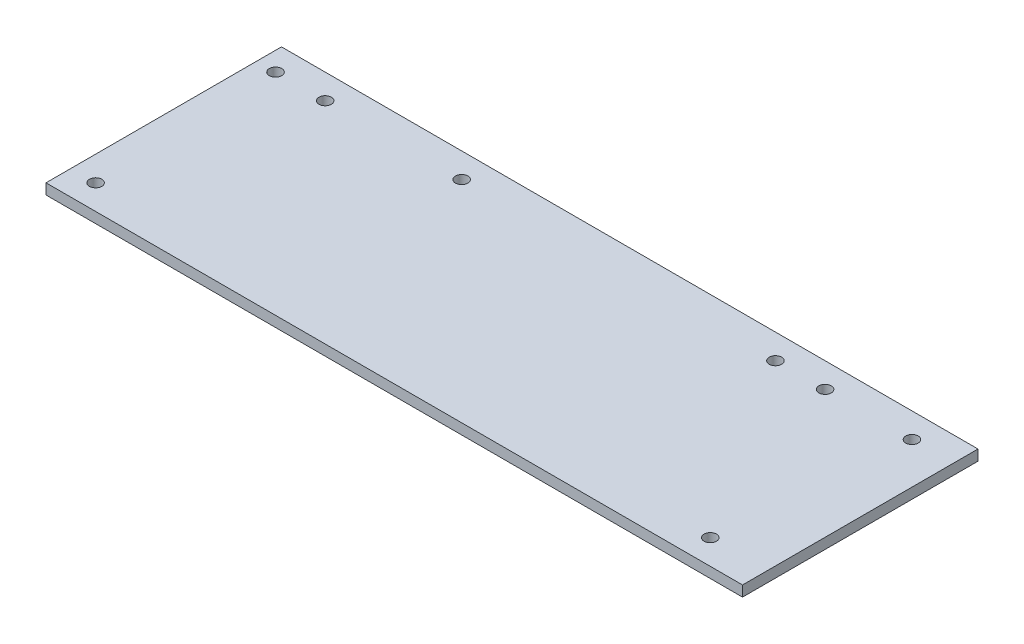
ISO-10303-21;
HEADER;
FILE_DESCRIPTION(('STEP AP214'),'2;1');
FILE_NAME('part.step','',(''),(''),'','','');
FILE_SCHEMA(('AUTOMOTIVE_DESIGN { 1 0 10303 214 1 1 1 1 }'));
ENDSEC;
DATA;
#1=APPLICATION_CONTEXT('core data for automotive mechanical design processes');
#2=APPLICATION_PROTOCOL_DEFINITION('international standard','automotive_design',2000,#1);
#3=PRODUCT_CONTEXT('',#1,'mechanical');
#4=PRODUCT('Part','Part','',(#3));
#5=PRODUCT_RELATED_PRODUCT_CATEGORY('part','',(#4));
#6=PRODUCT_DEFINITION_FORMATION('','',#4);
#7=PRODUCT_DEFINITION_CONTEXT('part definition',#1,'design');
#8=PRODUCT_DEFINITION('design','',#6,#7);
#9=PRODUCT_DEFINITION_SHAPE('','',#8);
#10=(LENGTH_UNIT() NAMED_UNIT(*) SI_UNIT(.MILLI.,.METRE.));
#11=(NAMED_UNIT(*) PLANE_ANGLE_UNIT() SI_UNIT($,.RADIAN.));
#12=(NAMED_UNIT(*) SI_UNIT($,.STERADIAN.) SOLID_ANGLE_UNIT());
#13=UNCERTAINTY_MEASURE_WITH_UNIT(LENGTH_MEASURE(1.E-05),#10,'distance_accuracy_value','');
#14=(GEOMETRIC_REPRESENTATION_CONTEXT(3) GLOBAL_UNCERTAINTY_ASSIGNED_CONTEXT((#13)) GLOBAL_UNIT_ASSIGNED_CONTEXT((#10,
#11,#12)) REPRESENTATION_CONTEXT('',''));
#15=CARTESIAN_POINT('',(0.,0.,0.));
#16=DIRECTION('',(0.,0.,1.));
#17=DIRECTION('',(1.,0.,0.));
#18=AXIS2_PLACEMENT_3D('',#15,#16,#17);
#19=CARTESIAN_POINT('',(-190.881,5.4102,0.));
#20=DIRECTION('',(1.,0.,0.));
#21=DIRECTION('',(0.,0.,-1.));
#22=AXIS2_PLACEMENT_3D('',#19,#20,#21);
#23=PLANE('',#22);
#24=DIRECTION('',(0.,0.,1.));
#25=VECTOR('',#24,1.);
#26=CARTESIAN_POINT('',(-190.881,0.,0.));
#27=LINE('',#26,#25);
#28=CARTESIAN_POINT('',(-190.881,0.,-47.5361));
#29=VERTEX_POINT('',#28);
#30=CARTESIAN_POINT('',(-190.881,0.,72.9361));
#31=VERTEX_POINT('',#30);
#32=EDGE_CURVE('E122',#29,#31,#27,.T.);
#33=ORIENTED_EDGE('',*,*,#32,.T.);
#34=DIRECTION('',(0.,-1.,0.));
#35=VECTOR('',#34,1.);
#36=CARTESIAN_POINT('',(-190.881,5.4102,72.9361));
#37=LINE('',#36,#35);
#38=CARTESIAN_POINT('',(-190.881,5.4102,72.9361));
#39=VERTEX_POINT('',#38);
#40=EDGE_CURVE('E11',#39,#31,#37,.T.);
#41=ORIENTED_EDGE('',*,*,#40,.F.);
#42=DIRECTION('',(0.,0.,1.));
#43=VECTOR('',#42,1.);
#44=CARTESIAN_POINT('',(-190.881,5.4102,0.));
#45=LINE('',#44,#43);
#46=CARTESIAN_POINT('',(-190.881,5.4102,-47.5361));
#47=VERTEX_POINT('',#46);
#48=EDGE_CURVE('E84',#47,#39,#45,.T.);
#49=ORIENTED_EDGE('',*,*,#48,.F.);
#50=DIRECTION('',(0.,-1.,0.));
#51=VECTOR('',#50,1.);
#52=CARTESIAN_POINT('',(-190.881,5.4102,-47.5361));
#53=LINE('',#52,#51);
#54=EDGE_CURVE('E50',#47,#29,#53,.T.);
#55=ORIENTED_EDGE('',*,*,#54,.T.);
#56=EDGE_LOOP('',(#33,#41,#49,#55));
#57=FACE_BOUND('',#56,.T.);
#58=ADVANCED_FACE('F34',(#57),#23,.F.);
#59=CARTESIAN_POINT('',(0.,5.4102,72.9361));
#60=DIRECTION('',(0.,0.,-1.));
#61=DIRECTION('',(-1.,0.,0.));
#62=AXIS2_PLACEMENT_3D('',#59,#60,#61);
#63=PLANE('',#62);
#64=DIRECTION('',(1.,0.,0.));
#65=VECTOR('',#64,1.);
#66=CARTESIAN_POINT('',(0.,0.,72.9361));
#67=LINE('',#66,#65);
#68=CARTESIAN_POINT('',(165.481,0.,72.9361));
#69=VERTEX_POINT('',#68);
#70=EDGE_CURVE('E89',#31,#69,#67,.T.);
#71=ORIENTED_EDGE('',*,*,#70,.T.);
#72=DIRECTION('',(0.,-1.,0.));
#73=VECTOR('',#72,1.);
#74=CARTESIAN_POINT('',(165.481,5.4102,72.9361));
#75=LINE('',#74,#73);
#76=CARTESIAN_POINT('',(165.481,5.4102,72.9361));
#77=VERTEX_POINT('',#76);
#78=EDGE_CURVE('E42',#77,#69,#75,.T.);
#79=ORIENTED_EDGE('',*,*,#78,.F.);
#80=DIRECTION('',(1.,0.,0.));
#81=VECTOR('',#80,1.);
#82=CARTESIAN_POINT('',(0.,5.4102,72.9361));
#83=LINE('',#82,#81);
#84=EDGE_CURVE('E76',#39,#77,#83,.T.);
#85=ORIENTED_EDGE('',*,*,#84,.F.);
#86=ORIENTED_EDGE('',*,*,#40,.T.);
#87=EDGE_LOOP('',(#71,#79,#85,#86));
#88=FACE_BOUND('',#87,.T.);
#89=ADVANCED_FACE('F88',(#88),#63,.F.);
#90=CARTESIAN_POINT('',(165.481,5.4102,0.));
#91=DIRECTION('',(-1.,0.,0.));
#92=DIRECTION('',(0.,0.,1.));
#93=AXIS2_PLACEMENT_3D('',#90,#91,#92);
#94=PLANE('',#93);
#95=DIRECTION('',(0.,0.,-1.));
#96=VECTOR('',#95,1.);
#97=CARTESIAN_POINT('',(165.481,0.,0.));
#98=LINE('',#97,#96);
#99=CARTESIAN_POINT('',(165.481,0.,-47.5361));
#100=VERTEX_POINT('',#99);
#101=EDGE_CURVE('E125',#69,#100,#98,.T.);
#102=ORIENTED_EDGE('',*,*,#101,.T.);
#103=DIRECTION('',(0.,-1.,0.));
#104=VECTOR('',#103,1.);
#105=CARTESIAN_POINT('',(165.481,5.4102,-47.5361));
#106=LINE('',#105,#104);
#107=CARTESIAN_POINT('',(165.481,5.4102,-47.5361));
#108=VERTEX_POINT('',#107);
#109=EDGE_CURVE('E65',#108,#100,#106,.T.);
#110=ORIENTED_EDGE('',*,*,#109,.F.);
#111=DIRECTION('',(0.,0.,-1.));
#112=VECTOR('',#111,1.);
#113=CARTESIAN_POINT('',(165.481,5.4102,0.));
#114=LINE('',#113,#112);
#115=EDGE_CURVE('E83',#77,#108,#114,.T.);
#116=ORIENTED_EDGE('',*,*,#115,.F.);
#117=ORIENTED_EDGE('',*,*,#78,.T.);
#118=EDGE_LOOP('',(#102,#110,#116,#117));
#119=FACE_BOUND('',#118,.T.);
#120=ADVANCED_FACE('F92',(#119),#94,.F.);
#121=CARTESIAN_POINT('',(136.271,5.4102,60.2361));
#122=DIRECTION('',(0.,-1.,0.));
#123=DIRECTION('',(0.,0.,-1.));
#124=AXIS2_PLACEMENT_3D('',#121,#122,#123);
#125=CYLINDRICAL_SURFACE('',#124,3.175);
#126=CARTESIAN_POINT('',(136.271,5.4102,60.2361));
#127=DIRECTION('',(0.,1.,0.));
#128=DIRECTION('',(0.,0.,1.));
#129=AXIS2_PLACEMENT_3D('',#126,#127,#128);
#130=CIRCLE('',#129,3.175);
#131=CARTESIAN_POINT('',(136.271,5.4102,63.4111));
#132=VERTEX_POINT('',#131);
#133=EDGE_CURVE('E116',#132,#132,#130,.T.);
#134=ORIENTED_EDGE('',*,*,#133,.T.);
#135=EDGE_LOOP('',(#134));
#136=FACE_BOUND('',#135,.T.);
#137=CARTESIAN_POINT('',(136.271,0.,60.2361));
#138=DIRECTION('',(0.,1.,0.));
#139=DIRECTION('',(0.,0.,1.));
#140=AXIS2_PLACEMENT_3D('',#137,#138,#139);
#141=CIRCLE('',#140,3.175);
#142=CARTESIAN_POINT('',(136.271,0.,63.4111));
#143=VERTEX_POINT('',#142);
#144=EDGE_CURVE('E148',#143,#143,#141,.T.);
#145=ORIENTED_EDGE('',*,*,#144,.F.);
#146=EDGE_LOOP('',(#145));
#147=FACE_BOUND('',#146,.T.);
#148=ADVANCED_FACE('F194',(#136,#147),#125,.F.);
#149=CARTESIAN_POINT('',(-181.229,5.4102,-34.8361));
#150=DIRECTION('',(0.,-1.,0.));
#151=DIRECTION('',(0.,0.,-1.));
#152=AXIS2_PLACEMENT_3D('',#149,#150,#151);
#153=CYLINDRICAL_SURFACE('',#152,3.175);
#154=CARTESIAN_POINT('',(-181.229,5.4102,-34.8361));
#155=DIRECTION('',(0.,1.,0.));
#156=DIRECTION('',(0.,0.,1.));
#157=AXIS2_PLACEMENT_3D('',#154,#155,#156);
#158=CIRCLE('',#157,3.175);
#159=CARTESIAN_POINT('',(-181.229,5.4102,-31.6611));
#160=VERTEX_POINT('',#159);
#161=EDGE_CURVE('E113',#160,#160,#158,.T.);
#162=ORIENTED_EDGE('',*,*,#161,.T.);
#163=EDGE_LOOP('',(#162));
#164=FACE_BOUND('',#163,.T.);
#165=CARTESIAN_POINT('',(-181.229,0.,-34.8361));
#166=DIRECTION('',(0.,1.,0.));
#167=DIRECTION('',(0.,0.,1.));
#168=AXIS2_PLACEMENT_3D('',#165,#166,#167);
#169=CIRCLE('',#168,3.175);
#170=CARTESIAN_POINT('',(-181.229,0.,-31.6611));
#171=VERTEX_POINT('',#170);
#172=EDGE_CURVE('E145',#171,#171,#169,.T.);
#173=ORIENTED_EDGE('',*,*,#172,.F.);
#174=EDGE_LOOP('',(#173));
#175=FACE_BOUND('',#174,.T.);
#176=ADVANCED_FACE('F196',(#164,#175),#153,.F.);
#177=CARTESIAN_POINT('',(-155.829,5.4102,-34.8361));
#178=DIRECTION('',(0.,-1.,0.));
#179=DIRECTION('',(0.,0.,-1.));
#180=AXIS2_PLACEMENT_3D('',#177,#178,#179);
#181=CYLINDRICAL_SURFACE('',#180,3.175);
#182=CARTESIAN_POINT('',(-155.829,5.4102,-34.8361));
#183=DIRECTION('',(0.,1.,0.));
#184=DIRECTION('',(0.,0.,1.));
#185=AXIS2_PLACEMENT_3D('',#182,#183,#184);
#186=CIRCLE('',#185,3.175);
#187=CARTESIAN_POINT('',(-155.829,5.4102,-31.6611));
#188=VERTEX_POINT('',#187);
#189=EDGE_CURVE('E110',#188,#188,#186,.T.);
#190=ORIENTED_EDGE('',*,*,#189,.T.);
#191=EDGE_LOOP('',(#190));
#192=FACE_BOUND('',#191,.T.);
#193=CARTESIAN_POINT('',(-155.829,0.,-34.8361));
#194=DIRECTION('',(0.,1.,0.));
#195=DIRECTION('',(0.,0.,1.));
#196=AXIS2_PLACEMENT_3D('',#193,#194,#195);
#197=CIRCLE('',#196,3.175);
#198=CARTESIAN_POINT('',(-155.829,0.,-31.6611));
#199=VERTEX_POINT('',#198);
#200=EDGE_CURVE('E142',#199,#199,#197,.T.);
#201=ORIENTED_EDGE('',*,*,#200,.F.);
#202=EDGE_LOOP('',(#201));
#203=FACE_BOUND('',#202,.T.);
#204=ADVANCED_FACE('F202',(#192,#203),#181,.F.);
#205=CARTESIAN_POINT('',(-86.0069399999999,5.4102,-34.8361));
#206=DIRECTION('',(0.,-1.,0.));
#207=DIRECTION('',(0.,0.,-1.));
#208=AXIS2_PLACEMENT_3D('',#205,#206,#207);
#209=CYLINDRICAL_SURFACE('',#208,3.175);
#210=CARTESIAN_POINT('',(-86.0069399999999,5.4102,-34.8361));
#211=DIRECTION('',(0.,1.,0.));
#212=DIRECTION('',(0.,0.,1.));
#213=AXIS2_PLACEMENT_3D('',#210,#211,#212);
#214=CIRCLE('',#213,3.175);
#215=CARTESIAN_POINT('',(-86.0069399999999,5.4102,-31.6611));
#216=VERTEX_POINT('',#215);
#217=EDGE_CURVE('E107',#216,#216,#214,.T.);
#218=ORIENTED_EDGE('',*,*,#217,.T.);
#219=EDGE_LOOP('',(#218));
#220=FACE_BOUND('',#219,.T.);
#221=CARTESIAN_POINT('',(-86.0069399999999,0.,-34.8361));
#222=DIRECTION('',(0.,1.,0.));
#223=DIRECTION('',(0.,0.,1.));
#224=AXIS2_PLACEMENT_3D('',#221,#222,#223);
#225=CIRCLE('',#224,3.175);
#226=CARTESIAN_POINT('',(-86.0069399999999,0.,-31.6611));
#227=VERTEX_POINT('',#226);
#228=EDGE_CURVE('E139',#227,#227,#225,.T.);
#229=ORIENTED_EDGE('',*,*,#228,.F.);
#230=EDGE_LOOP('',(#229));
#231=FACE_BOUND('',#230,.T.);
#232=ADVANCED_FACE('F209',(#220,#231),#209,.F.);
#233=CARTESIAN_POINT('',(99.9490000000001,5.4102,-34.8361));
#234=DIRECTION('',(0.,-1.,0.));
#235=DIRECTION('',(0.,0.,-1.));
#236=AXIS2_PLACEMENT_3D('',#233,#234,#235);
#237=CYLINDRICAL_SURFACE('',#236,3.175);
#238=CARTESIAN_POINT('',(99.9490000000001,5.4102,-34.8361));
#239=DIRECTION('',(0.,1.,0.));
#240=DIRECTION('',(0.,0.,1.));
#241=AXIS2_PLACEMENT_3D('',#238,#239,#240);
#242=CIRCLE('',#241,3.175);
#243=CARTESIAN_POINT('',(99.9490000000001,5.4102,-31.6611));
#244=VERTEX_POINT('',#243);
#245=EDGE_CURVE('E104',#244,#244,#242,.T.);
#246=ORIENTED_EDGE('',*,*,#245,.T.);
#247=EDGE_LOOP('',(#246));
#248=FACE_BOUND('',#247,.T.);
#249=CARTESIAN_POINT('',(99.9490000000001,0.,-34.8361));
#250=DIRECTION('',(0.,1.,0.));
#251=DIRECTION('',(0.,0.,1.));
#252=AXIS2_PLACEMENT_3D('',#249,#250,#251);
#253=CIRCLE('',#252,3.175);
#254=CARTESIAN_POINT('',(99.9490000000001,0.,-31.6611));
#255=VERTEX_POINT('',#254);
#256=EDGE_CURVE('E136',#255,#255,#253,.T.);
#257=ORIENTED_EDGE('',*,*,#256,.F.);
#258=EDGE_LOOP('',(#257));
#259=FACE_BOUND('',#258,.T.);
#260=ADVANCED_FACE('F213',(#248,#259),#237,.F.);
#261=CARTESIAN_POINT('',(144.399,5.4102,-34.8361));
#262=DIRECTION('',(0.,-1.,0.));
#263=DIRECTION('',(0.,0.,-1.));
#264=AXIS2_PLACEMENT_3D('',#261,#262,#263);
#265=CYLINDRICAL_SURFACE('',#264,3.17499999999997);
#266=CARTESIAN_POINT('',(144.399,5.4102,-34.8361));
#267=DIRECTION('',(0.,1.,0.));
#268=DIRECTION('',(0.,0.,1.));
#269=AXIS2_PLACEMENT_3D('',#266,#267,#268);
#270=CIRCLE('',#269,3.17499999999997);
#271=CARTESIAN_POINT('',(144.399,5.4102,-31.6611));
#272=VERTEX_POINT('',#271);
#273=EDGE_CURVE('E101',#272,#272,#270,.T.);
#274=ORIENTED_EDGE('',*,*,#273,.T.);
#275=EDGE_LOOP('',(#274));
#276=FACE_BOUND('',#275,.T.);
#277=CARTESIAN_POINT('',(144.399,0.,-34.8361));
#278=DIRECTION('',(0.,1.,0.));
#279=DIRECTION('',(0.,0.,1.));
#280=AXIS2_PLACEMENT_3D('',#277,#278,#279);
#281=CIRCLE('',#280,3.17499999999997);
#282=CARTESIAN_POINT('',(144.399,0.,-31.6611));
#283=VERTEX_POINT('',#282);
#284=EDGE_CURVE('E133',#283,#283,#281,.T.);
#285=ORIENTED_EDGE('',*,*,#284,.F.);
#286=EDGE_LOOP('',(#285));
#287=FACE_BOUND('',#286,.T.);
#288=ADVANCED_FACE('F217',(#276,#287),#265,.F.);
#289=CARTESIAN_POINT('',(74.5490000000001,5.4102,-34.8361));
#290=DIRECTION('',(0.,-1.,0.));
#291=DIRECTION('',(0.,0.,-1.));
#292=AXIS2_PLACEMENT_3D('',#289,#290,#291);
#293=CYLINDRICAL_SURFACE('',#292,3.175);
#294=CARTESIAN_POINT('',(74.5490000000001,5.4102,-34.8361));
#295=DIRECTION('',(0.,1.,0.));
#296=DIRECTION('',(0.,0.,1.));
#297=AXIS2_PLACEMENT_3D('',#294,#295,#296);
#298=CIRCLE('',#297,3.175);
#299=CARTESIAN_POINT('',(74.5490000000001,5.4102,-31.6611));
#300=VERTEX_POINT('',#299);
#301=EDGE_CURVE('E95',#300,#300,#298,.T.);
#302=ORIENTED_EDGE('',*,*,#301,.T.);
#303=EDGE_LOOP('',(#302));
#304=FACE_BOUND('',#303,.T.);
#305=CARTESIAN_POINT('',(74.5490000000001,0.,-34.8361));
#306=DIRECTION('',(0.,1.,0.));
#307=DIRECTION('',(0.,0.,1.));
#308=AXIS2_PLACEMENT_3D('',#305,#306,#307);
#309=CIRCLE('',#308,3.175);
#310=CARTESIAN_POINT('',(74.5490000000001,0.,-31.6611));
#311=VERTEX_POINT('',#310);
#312=EDGE_CURVE('E130',#311,#311,#309,.T.);
#313=ORIENTED_EDGE('',*,*,#312,.F.);
#314=EDGE_LOOP('',(#313));
#315=FACE_BOUND('',#314,.T.);
#316=ADVANCED_FACE('F169',(#304,#315),#293,.F.);
#317=CARTESIAN_POINT('',(0.,5.4102,-47.5361));
#318=DIRECTION('',(0.,0.,-1.));
#319=DIRECTION('',(-1.,0.,0.));
#320=AXIS2_PLACEMENT_3D('',#317,#318,#319);
#321=PLANE('',#320);
#322=DIRECTION('',(1.,0.,0.));
#323=VECTOR('',#322,1.);
#324=CARTESIAN_POINT('',(0.,0.,-47.5361));
#325=LINE('',#324,#323);
#326=EDGE_CURVE('E127',#29,#100,#325,.T.);
#327=ORIENTED_EDGE('',*,*,#326,.F.);
#328=ORIENTED_EDGE('',*,*,#54,.F.);
#329=DIRECTION('',(1.,0.,0.));
#330=VECTOR('',#329,1.);
#331=CARTESIAN_POINT('',(0.,5.4102,-47.5361));
#332=LINE('',#331,#330);
#333=EDGE_CURVE('E93',#47,#108,#332,.T.);
#334=ORIENTED_EDGE('',*,*,#333,.T.);
#335=ORIENTED_EDGE('',*,*,#109,.T.);
#336=EDGE_LOOP('',(#327,#328,#334,#335));
#337=FACE_BOUND('',#336,.T.);
#338=ADVANCED_FACE('F161',(#337),#321,.T.);
#339=CARTESIAN_POINT('',(-178.181,5.4102,60.2361));
#340=DIRECTION('',(0.,-1.,0.));
#341=DIRECTION('',(0.,0.,-1.));
#342=AXIS2_PLACEMENT_3D('',#339,#340,#341);
#343=CYLINDRICAL_SURFACE('',#342,3.175);
#344=CARTESIAN_POINT('',(-178.181,5.4102,60.2361));
#345=DIRECTION('',(0.,1.,0.));
#346=DIRECTION('',(0.,0.,1.));
#347=AXIS2_PLACEMENT_3D('',#344,#345,#346);
#348=CIRCLE('',#347,3.175);
#349=CARTESIAN_POINT('',(-178.181,5.4102,63.4111));
#350=VERTEX_POINT('',#349);
#351=EDGE_CURVE('E119',#350,#350,#348,.T.);
#352=ORIENTED_EDGE('',*,*,#351,.T.);
#353=EDGE_LOOP('',(#352));
#354=FACE_BOUND('',#353,.T.);
#355=CARTESIAN_POINT('',(-178.181,0.,60.2361));
#356=DIRECTION('',(0.,1.,0.));
#357=DIRECTION('',(0.,0.,1.));
#358=AXIS2_PLACEMENT_3D('',#355,#356,#357);
#359=CIRCLE('',#358,3.175);
#360=CARTESIAN_POINT('',(-178.181,0.,63.4111));
#361=VERTEX_POINT('',#360);
#362=EDGE_CURVE('E151',#361,#361,#359,.T.);
#363=ORIENTED_EDGE('',*,*,#362,.F.);
#364=EDGE_LOOP('',(#363));
#365=FACE_BOUND('',#364,.T.);
#366=ADVANCED_FACE('F159',(#354,#365),#343,.F.);
#367=CARTESIAN_POINT('',(0.,5.4102,0.));
#368=DIRECTION('',(0.,1.,0.));
#369=DIRECTION('',(0.,0.,1.));
#370=AXIS2_PLACEMENT_3D('',#367,#368,#369);
#371=PLANE('',#370);
#372=ORIENTED_EDGE('',*,*,#48,.T.);
#373=ORIENTED_EDGE('',*,*,#84,.T.);
#374=ORIENTED_EDGE('',*,*,#115,.T.);
#375=ORIENTED_EDGE('',*,*,#333,.F.);
#376=EDGE_LOOP('',(#372,#373,#374,#375));
#377=FACE_BOUND('',#376,.T.);
#378=ORIENTED_EDGE('',*,*,#301,.F.);
#379=EDGE_LOOP('',(#378));
#380=FACE_BOUND('',#379,.T.);
#381=ORIENTED_EDGE('',*,*,#273,.F.);
#382=EDGE_LOOP('',(#381));
#383=FACE_BOUND('',#382,.T.);
#384=ORIENTED_EDGE('',*,*,#245,.F.);
#385=EDGE_LOOP('',(#384));
#386=FACE_BOUND('',#385,.T.);
#387=ORIENTED_EDGE('',*,*,#217,.F.);
#388=EDGE_LOOP('',(#387));
#389=FACE_BOUND('',#388,.T.);
#390=ORIENTED_EDGE('',*,*,#189,.F.);
#391=EDGE_LOOP('',(#390));
#392=FACE_BOUND('',#391,.T.);
#393=ORIENTED_EDGE('',*,*,#161,.F.);
#394=EDGE_LOOP('',(#393));
#395=FACE_BOUND('',#394,.T.);
#396=ORIENTED_EDGE('',*,*,#133,.F.);
#397=EDGE_LOOP('',(#396));
#398=FACE_BOUND('',#397,.T.);
#399=ORIENTED_EDGE('',*,*,#351,.F.);
#400=EDGE_LOOP('',(#399));
#401=FACE_BOUND('',#400,.T.);
#402=ADVANCED_FACE('F79',(#377,#380,#383,#386,#389,#392,#395,#398,#401),#371,.T.);
#403=CARTESIAN_POINT('',(0.,0.,0.));
#404=DIRECTION('',(0.,1.,0.));
#405=DIRECTION('',(0.,0.,1.));
#406=AXIS2_PLACEMENT_3D('',#403,#404,#405);
#407=PLANE('',#406);
#408=ORIENTED_EDGE('',*,*,#32,.F.);
#409=ORIENTED_EDGE('',*,*,#326,.T.);
#410=ORIENTED_EDGE('',*,*,#101,.F.);
#411=ORIENTED_EDGE('',*,*,#70,.F.);
#412=EDGE_LOOP('',(#408,#409,#410,#411));
#413=FACE_BOUND('',#412,.T.);
#414=ORIENTED_EDGE('',*,*,#312,.T.);
#415=EDGE_LOOP('',(#414));
#416=FACE_BOUND('',#415,.T.);
#417=ORIENTED_EDGE('',*,*,#284,.T.);
#418=EDGE_LOOP('',(#417));
#419=FACE_BOUND('',#418,.T.);
#420=ORIENTED_EDGE('',*,*,#256,.T.);
#421=EDGE_LOOP('',(#420));
#422=FACE_BOUND('',#421,.T.);
#423=ORIENTED_EDGE('',*,*,#228,.T.);
#424=EDGE_LOOP('',(#423));
#425=FACE_BOUND('',#424,.T.);
#426=ORIENTED_EDGE('',*,*,#200,.T.);
#427=EDGE_LOOP('',(#426));
#428=FACE_BOUND('',#427,.T.);
#429=ORIENTED_EDGE('',*,*,#172,.T.);
#430=EDGE_LOOP('',(#429));
#431=FACE_BOUND('',#430,.T.);
#432=ORIENTED_EDGE('',*,*,#144,.T.);
#433=EDGE_LOOP('',(#432));
#434=FACE_BOUND('',#433,.T.);
#435=ORIENTED_EDGE('',*,*,#362,.T.);
#436=EDGE_LOOP('',(#435));
#437=FACE_BOUND('',#436,.T.);
#438=ADVANCED_FACE('F157',(#413,#416,#419,#422,#425,#428,#431,#434,#437),#407,.F.);
#439=CLOSED_SHELL('',(#58,#89,#120,#148,#176,#204,#232,#260,#288,#316,#338,#366,#402,#438));
#440=MANIFOLD_SOLID_BREP('B2',#439);
#441=ADVANCED_BREP_SHAPE_REPRESENTATION('',(#18,#440),#14);
#442=SHAPE_DEFINITION_REPRESENTATION(#9,#441);
ENDSEC;
END-ISO-10303-21;
